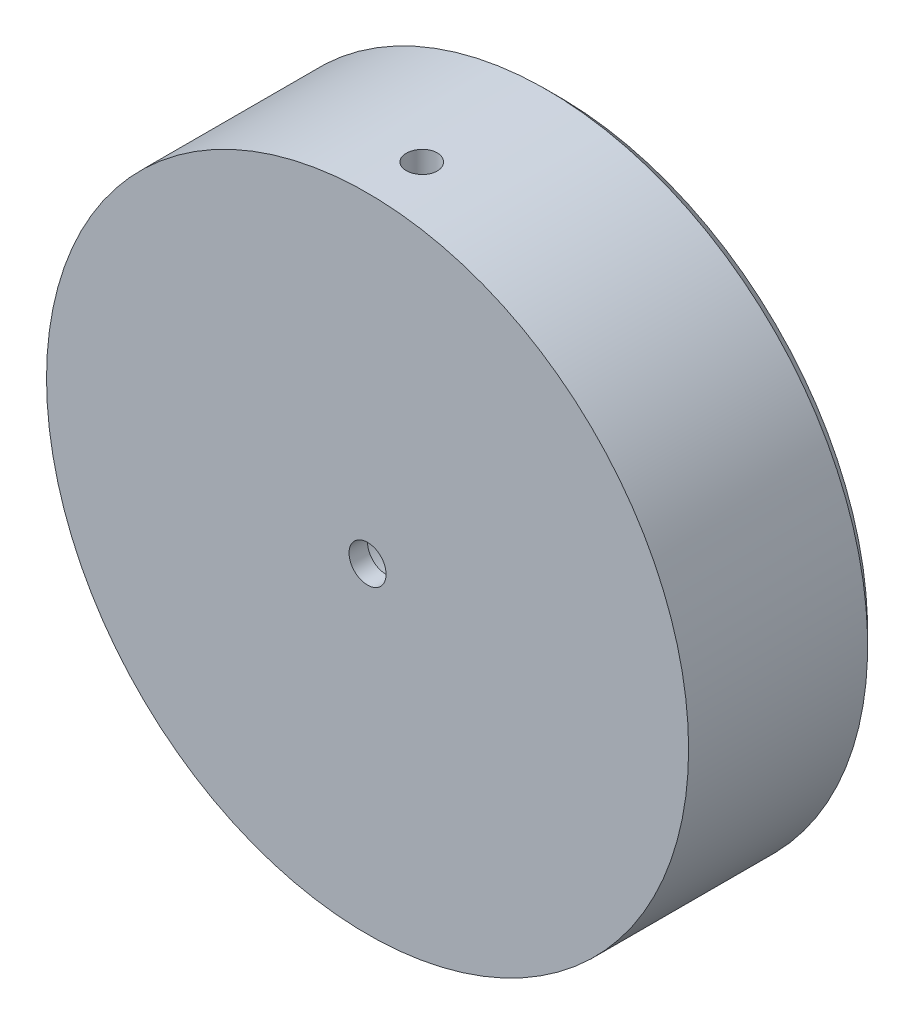
ISO-10303-21;
HEADER;
FILE_DESCRIPTION(('STEP AP214'),'2;1');
FILE_NAME('part.step','',(''),(''),'','','');
FILE_SCHEMA(('AUTOMOTIVE_DESIGN { 1 0 10303 214 1 1 1 1 }'));
ENDSEC;
DATA;
#1=APPLICATION_CONTEXT('core data for automotive mechanical design processes');
#2=APPLICATION_PROTOCOL_DEFINITION('international standard','automotive_design',2000,#1);
#3=PRODUCT_CONTEXT('',#1,'mechanical');
#4=PRODUCT('Part','Part','',(#3));
#5=PRODUCT_RELATED_PRODUCT_CATEGORY('part','',(#4));
#6=PRODUCT_DEFINITION_FORMATION('','',#4);
#7=PRODUCT_DEFINITION_CONTEXT('part definition',#1,'design');
#8=PRODUCT_DEFINITION('design','',#6,#7);
#9=PRODUCT_DEFINITION_SHAPE('','',#8);
#10=(LENGTH_UNIT() NAMED_UNIT(*) SI_UNIT(.MILLI.,.METRE.));
#11=(NAMED_UNIT(*) PLANE_ANGLE_UNIT() SI_UNIT($,.RADIAN.));
#12=(NAMED_UNIT(*) SI_UNIT($,.STERADIAN.) SOLID_ANGLE_UNIT());
#13=UNCERTAINTY_MEASURE_WITH_UNIT(LENGTH_MEASURE(1.E-05),#10,'distance_accuracy_value','');
#14=(GEOMETRIC_REPRESENTATION_CONTEXT(3) GLOBAL_UNCERTAINTY_ASSIGNED_CONTEXT((#13)) GLOBAL_UNIT_ASSIGNED_CONTEXT((#10,
#11,#12)) REPRESENTATION_CONTEXT('',''));
#15=CARTESIAN_POINT('',(0.,0.,0.));
#16=DIRECTION('',(0.,0.,1.));
#17=DIRECTION('',(1.,0.,0.));
#18=AXIS2_PLACEMENT_3D('',#15,#16,#17);
#19=CARTESIAN_POINT('',(0.,0.,11.));
#20=DIRECTION('',(0.,0.,-1.));
#21=DIRECTION('',(-1.,0.,0.));
#22=AXIS2_PLACEMENT_3D('',#19,#20,#21);
#23=CYLINDRICAL_SURFACE('',#22,26.);
#24=CARTESIAN_POINT('',(0.,0.,2.99999999999998));
#25=DIRECTION('',(0.,0.,-1.));
#26=DIRECTION('',(-1.,0.,0.));
#27=AXIS2_PLACEMENT_3D('',#24,#25,#26);
#28=CIRCLE('',#27,26.);
#29=CARTESIAN_POINT('',(-26.,0.,2.99999999999998));
#30=VERTEX_POINT('',#29);
#31=EDGE_CURVE('E12',#30,#30,#28,.F.);
#32=ORIENTED_EDGE('',*,*,#31,.T.);
#33=EDGE_LOOP('',(#32));
#34=FACE_BOUND('',#33,.T.);
#35=CARTESIAN_POINT('',(0.,0.,17.5));
#36=DIRECTION('',(0.,0.,1.));
#37=DIRECTION('',(1.,0.,0.));
#38=AXIS2_PLACEMENT_3D('',#35,#36,#37);
#39=CIRCLE('',#38,26.);
#40=CARTESIAN_POINT('',(26.,0.,17.5));
#41=VERTEX_POINT('',#40);
#42=EDGE_CURVE('E141',#41,#41,#39,.T.);
#43=ORIENTED_EDGE('',*,*,#42,.F.);
#44=EDGE_LOOP('',(#43));
#45=FACE_BOUND('',#44,.T.);
#46=CARTESIAN_POINT('',(0.,-26.,11.8645712177792));
#47=CARTESIAN_POINT('',(0.0701695561151652,-25.9999995976547,11.8645743157667));
#48=CARTESIAN_POINT('',(0.140388958718594,-25.9997128936258,11.8704995807191));
#49=CARTESIAN_POINT('',(0.27889090278876,-25.9985967368913,11.8940527434735));
#50=CARTESIAN_POINT('',(0.347171059186724,-25.9977666436775,11.9116944521335));
#51=CARTESIAN_POINT('',(0.479768117073597,-25.9956576674722,11.9581744506978));
#52=CARTESIAN_POINT('',(0.544087009687894,-25.9943790121503,11.9870070613979));
#53=CARTESIAN_POINT('',(0.666954480148832,-25.9915169453824,12.0550417525321));
#54=CARTESIAN_POINT('',(0.725504421104487,-25.9899336061905,12.0942413753071));
#55=CARTESIAN_POINT('',(0.835244792595786,-25.9866386346083,12.1819387219476));
#56=CARTESIAN_POINT('',(0.886429111167759,-25.9849268974451,12.2304440907066));
#57=CARTESIAN_POINT('',(0.979933258922688,-25.9815689581539,12.3353608855472));
#58=CARTESIAN_POINT('',(1.02225272708221,-25.9799227586972,12.3917726334623));
#59=CARTESIAN_POINT('',(1.09684231530584,-25.9768808016322,12.5109323922144));
#60=CARTESIAN_POINT('',(1.12910772587333,-25.9754851615196,12.5736833542812));
#61=CARTESIAN_POINT('',(1.18264306894247,-25.9731029643225,12.7037194831363));
#62=CARTESIAN_POINT('',(1.20391308023333,-25.9721164043067,12.7710046174304));
#63=CARTESIAN_POINT('',(1.2348378712367,-25.9706645550608,12.9081434547726));
#64=CARTESIAN_POINT('',(1.24450170422026,-25.9701988595557,12.9779951119394));
#65=CARTESIAN_POINT('',(1.25196774759407,-25.9698400341948,13.1183306222645));
#66=CARTESIAN_POINT('',(1.24977004613307,-25.9699469000839,13.1888144707208));
#67=CARTESIAN_POINT('',(1.23358295325855,-25.9707207687367,13.3283520675029));
#68=CARTESIAN_POINT('',(1.21960334242497,-25.9713873068948,13.3974069533607));
#69=CARTESIAN_POINT('',(1.18026441506609,-25.9732046614086,13.5321887258588));
#70=CARTESIAN_POINT('',(1.15490505316052,-25.9743554796955,13.5979155992263));
#71=CARTESIAN_POINT('',(1.09351530520789,-25.9770122201859,13.7242071165568));
#72=CARTESIAN_POINT('',(1.05748045716981,-25.9785182908191,13.7847695883168));
#73=CARTESIAN_POINT('',(0.975765888908268,-25.9817156318731,13.8989893933324));
#74=CARTESIAN_POINT('',(0.930086106038823,-25.9834069034968,13.9526466817336));
#75=CARTESIAN_POINT('',(0.830323141173972,-25.9867860851073,14.0515899167652));
#76=CARTESIAN_POINT('',(0.776231488588205,-25.9884739899492,14.0968673232447));
#77=CARTESIAN_POINT('',(0.66121002860167,-25.9916545390095,14.1776997344055));
#78=CARTESIAN_POINT('',(0.600280219599253,-25.9931471831821,14.2132547368097));
#79=CARTESIAN_POINT('',(0.473307051874366,-25.995769042974,14.2736322304731));
#80=CARTESIAN_POINT('',(0.407263552861189,-25.9968982486182,14.2984544271618));
#81=CARTESIAN_POINT('',(0.271939943082523,-25.9986658180569,14.3366561318553));
#82=CARTESIAN_POINT('',(0.202659854731745,-25.9993041852501,14.3500357190925));
#83=CARTESIAN_POINT('',(0.062903821132136,-26.0000176943794,14.3649618890278));
#84=CARTESIAN_POINT('',(-0.00757085970868685,-26.0000933985952,14.3665202849011));
#85=CARTESIAN_POINT('',(-0.147780736000379,-25.9996745420575,14.3577906583359));
#86=CARTESIAN_POINT('',(-0.217515933708619,-25.9991799830452,14.3475026720707));
#87=CARTESIAN_POINT('',(-0.354234236143891,-25.9976766694653,14.3153820966644));
#88=CARTESIAN_POINT('',(-0.421218610143831,-25.9966681549919,14.2935548978886));
#89=CARTESIAN_POINT('',(-0.550572910728279,-25.9942504870279,14.2389809560771));
#90=CARTESIAN_POINT('',(-0.612942812770936,-25.9928413314067,14.2062341549711));
#91=CARTESIAN_POINT('',(-0.73135197588907,-25.9897795291454,14.1307203035818));
#92=CARTESIAN_POINT('',(-0.787386179380731,-25.9881266903718,14.0879453306799));
#93=CARTESIAN_POINT('',(-0.891482494695716,-25.9847643200244,13.9936009418443));
#94=CARTESIAN_POINT('',(-0.939544559017697,-25.9830547881128,13.9420314735132));
#95=CARTESIAN_POINT('',(-1.02637202583794,-25.9797701157755,13.831511164261));
#96=CARTESIAN_POINT('',(-1.06512978778986,-25.9781950864805,13.7725543169901));
#97=CARTESIAN_POINT('',(-1.13219624153139,-25.9753587700805,13.6489631941497));
#98=CARTESIAN_POINT('',(-1.16050497622999,-25.9740974816872,13.5843289418958));
#99=CARTESIAN_POINT('',(-1.2058564616082,-25.9720316670993,13.451246098698));
#100=CARTESIAN_POINT('',(-1.22290409155323,-25.9712269431036,13.382799173685));
#101=CARTESIAN_POINT('',(-1.24526540964632,-25.9701644448953,13.2440106019318));
#102=CARTESIAN_POINT('',(-1.25057915775418,-25.969906667888,13.1736689648753));
#103=CARTESIAN_POINT('',(-1.24932129687196,-25.969967202938,13.0331637883703));
#104=CARTESIAN_POINT('',(-1.24276170948845,-25.9702849323025,12.9630001407296));
#105=CARTESIAN_POINT('',(-1.21796821893264,-25.9714594379631,12.8247714537295));
#106=CARTESIAN_POINT('',(-1.19973429338584,-25.9723162152923,12.7567064183924));
#107=CARTESIAN_POINT('',(-1.15211212905805,-25.9744721205151,12.624604427026));
#108=CARTESIAN_POINT('',(-1.12272379169086,-25.9757712523183,12.5605675066043));
#109=CARTESIAN_POINT('',(-1.05362920251174,-25.978665398012,12.4383360722146));
#110=CARTESIAN_POINT('',(-1.01392327392123,-25.9802604026333,12.3801413753052));
#111=CARTESIAN_POINT('',(-0.925277902502913,-25.9835683515007,12.271186495163));
#112=CARTESIAN_POINT('',(-0.876330151668588,-25.9852814009774,12.2204330748221));
#113=CARTESIAN_POINT('',(-0.770594686785615,-25.9886316571485,12.1278482344445));
#114=CARTESIAN_POINT('',(-0.713805045535864,-25.990268845067,12.0860190140453));
#115=CARTESIAN_POINT('',(-0.593955935661774,-25.9932839501657,12.0124518784978));
#116=CARTESIAN_POINT('',(-0.530890739390169,-25.9946616271134,11.9807232950794));
#117=CARTESIAN_POINT('',(-0.400369159006748,-25.9969988103492,11.9283426285481));
#118=CARTESIAN_POINT('',(-0.332918073924432,-25.9979588108669,11.9076774475848));
#119=CARTESIAN_POINT('',(-0.22087256212091,-25.9990982367549,11.8834373278577));
#120=CARTESIAN_POINT('',(-0.177004061389329,-25.9994349140644,11.8763715534932));
#121=CARTESIAN_POINT('',(-0.0887636901767567,-25.9998859228688,11.8669375203478));
#122=CARTESIAN_POINT('',(-0.0443918200909543,-26.0000002545383,11.8645692578794));
#123=CARTESIAN_POINT('',(0.,-26.,11.8645712177792));
#124=B_SPLINE_CURVE_WITH_KNOTS('',3,(#46,#47,#48,#49,#50,#51,#52,#53,#54,#55,#56,#57,#58,#59,
#60,#61,#62,#63,#64,#65,#66,#67,#68,#69,#70,#71,#72,#73,#74,#75,#76,#77,#78,#79,#80,#81,#82,#83,
#84,#85,#86,#87,#88,#89,#90,#91,#92,#93,#94,#95,#96,#97,#98,#99,#100,#101,#102,#103,#104,#105,
#106,#107,#108,#109,#110,#111,#112,#113,#114,#115,#116,#117,#118,#119,#120,#121,#122,#123),
.UNSPECIFIED.,.T.,.F.,(4,2,2,2,2,2,2,2,2,2,2,2,2,2,2,2,2,2,2,2,2,2,2,2,2,2,2,2,2,2,2,2,2,2,2,2,
2,2,4),(0.,0.210346622928276,0.420941634856017,0.631429912618444,0.84186833556789,
1.05248038480846,1.26310100961498,1.47382014501586,1.68453777045565,1.89509092096289,
2.10564250675102,2.31601947818195,2.52639728856384,2.73686315408808,2.94733038667675,
3.1580109446923,3.36869155205407,3.57937794134848,3.79006287176936,4.000537232358,
4.21101095026024,4.42138643537371,4.63176303927882,4.8423064117655,5.0528510387127,
5.26356797464963,5.47428404526638,5.6849087558234,5.89553239009184,6.10594288978745,
6.31635379274736,6.52676655542824,6.73717272725723,6.94776895372633,7.15841702815379,
7.36925915413334,7.57985111114493,7.71292416004448,7.84599710447706),.UNSPECIFIED.);
#125=CARTESIAN_POINT('',(0.,-26.,11.8645712177792));
#126=VERTEX_POINT('',#125);
#127=EDGE_CURVE('E96',#126,#126,#124,.T.);
#128=ORIENTED_EDGE('',*,*,#127,.F.);
#129=EDGE_LOOP('',(#128));
#130=FACE_BOUND('',#129,.T.);
#131=CARTESIAN_POINT('',(0.,26.,11.8645712177792));
#132=CARTESIAN_POINT('',(-0.0701695561151617,25.9999995976547,11.8645743157667));
#133=CARTESIAN_POINT('',(-0.14038895871859,25.9997128936258,11.8704995807191));
#134=CARTESIAN_POINT('',(-0.278890902788757,25.9985967368913,11.8940527434735));
#135=CARTESIAN_POINT('',(-0.347171059186721,25.9977666436775,11.9116944521335));
#136=CARTESIAN_POINT('',(-0.479768117073594,25.9956576674722,11.9581744506978));
#137=CARTESIAN_POINT('',(-0.544087009687892,25.9943790121503,11.9870070613979));
#138=CARTESIAN_POINT('',(-0.66695448014883,25.9915169453824,12.0550417525321));
#139=CARTESIAN_POINT('',(-0.725504421104484,25.9899336061905,12.0942413753071));
#140=CARTESIAN_POINT('',(-0.835244792595782,25.9866386346083,12.1819387219476));
#141=CARTESIAN_POINT('',(-0.886429111167755,25.9849268974451,12.2304440907066));
#142=CARTESIAN_POINT('',(-0.979933258922685,25.9815689581539,12.3353608855472));
#143=CARTESIAN_POINT('',(-1.0222527270822,25.9799227586972,12.3917726334623));
#144=CARTESIAN_POINT('',(-1.09684231530584,25.9768808016322,12.5109323922144));
#145=CARTESIAN_POINT('',(-1.12910772587332,25.9754851615196,12.5736833542812));
#146=CARTESIAN_POINT('',(-1.18264306894246,25.9731029643225,12.7037194831363));
#147=CARTESIAN_POINT('',(-1.20391308023333,25.9721164043067,12.7710046174304));
#148=CARTESIAN_POINT('',(-1.2348378712367,25.9706645550608,12.9081434547726));
#149=CARTESIAN_POINT('',(-1.24450170422025,25.9701988595557,12.9779951119394));
#150=CARTESIAN_POINT('',(-1.25196774759407,25.9698400341948,13.1183306222645));
#151=CARTESIAN_POINT('',(-1.24977004613306,25.9699469000839,13.1888144707208));
#152=CARTESIAN_POINT('',(-1.23358295325855,25.9707207687367,13.3283520675029));
#153=CARTESIAN_POINT('',(-1.21960334242496,25.9713873068948,13.3974069533607));
#154=CARTESIAN_POINT('',(-1.18026441506609,25.9732046614086,13.5321887258588));
#155=CARTESIAN_POINT('',(-1.15490505316051,25.9743554796955,13.5979155992263));
#156=CARTESIAN_POINT('',(-1.09351530520788,25.9770122201859,13.7242071165568));
#157=CARTESIAN_POINT('',(-1.0574804571698,25.9785182908191,13.7847695883168));
#158=CARTESIAN_POINT('',(-0.975765888908264,25.9817156318731,13.8989893933324));
#159=CARTESIAN_POINT('',(-0.930086106038819,25.9834069034968,13.9526466817336));
#160=CARTESIAN_POINT('',(-0.830323141173969,25.9867860851073,14.0515899167652));
#161=CARTESIAN_POINT('',(-0.776231488588201,25.9884739899492,14.0968673232447));
#162=CARTESIAN_POINT('',(-0.661210028601667,25.9916545390095,14.1776997344055));
#163=CARTESIAN_POINT('',(-0.60028021959925,25.9931471831821,14.2132547368097));
#164=CARTESIAN_POINT('',(-0.473307051874363,25.995769042974,14.2736322304731));
#165=CARTESIAN_POINT('',(-0.407263552861185,25.9968982486182,14.2984544271618));
#166=CARTESIAN_POINT('',(-0.27193994308252,25.9986658180569,14.3366561318553));
#167=CARTESIAN_POINT('',(-0.202659854731742,25.9993041852501,14.3500357190925));
#168=CARTESIAN_POINT('',(-0.0629038211321324,26.0000176943794,14.3649618890278));
#169=CARTESIAN_POINT('',(0.0075708597086905,26.0000933985952,14.3665202849011));
#170=CARTESIAN_POINT('',(0.147780736000382,25.9996745420575,14.3577906583359));
#171=CARTESIAN_POINT('',(0.217515933708623,25.9991799830452,14.3475026720707));
#172=CARTESIAN_POINT('',(0.354234236143894,25.9976766694653,14.3153820966644));
#173=CARTESIAN_POINT('',(0.421218610143835,25.9966681549919,14.2935548978886));
#174=CARTESIAN_POINT('',(0.550572910728283,25.9942504870279,14.2389809560771));
#175=CARTESIAN_POINT('',(0.612942812770939,25.9928413314067,14.2062341549711));
#176=CARTESIAN_POINT('',(0.731351975889073,25.9897795291454,14.1307203035818));
#177=CARTESIAN_POINT('',(0.787386179380734,25.9881266903718,14.0879453306799));
#178=CARTESIAN_POINT('',(0.891482494695719,25.9847643200244,13.9936009418443));
#179=CARTESIAN_POINT('',(0.9395445590177,25.9830547881128,13.9420314735132));
#180=CARTESIAN_POINT('',(1.02637202583794,25.9797701157755,13.831511164261));
#181=CARTESIAN_POINT('',(1.06512978778987,25.9781950864805,13.7725543169901));
#182=CARTESIAN_POINT('',(1.13219624153139,25.9753587700805,13.6489631941497));
#183=CARTESIAN_POINT('',(1.16050497623,25.9740974816872,13.5843289418958));
#184=CARTESIAN_POINT('',(1.20585646160821,25.9720316670993,13.451246098698));
#185=CARTESIAN_POINT('',(1.22290409155323,25.9712269431036,13.382799173685));
#186=CARTESIAN_POINT('',(1.24526540964633,25.9701644448953,13.2440106019318));
#187=CARTESIAN_POINT('',(1.25057915775418,25.969906667888,13.1736689648753));
#188=CARTESIAN_POINT('',(1.24932129687197,25.969967202938,13.0331637883703));
#189=CARTESIAN_POINT('',(1.24276170948845,25.9702849323025,12.9630001407296));
#190=CARTESIAN_POINT('',(1.21796821893264,25.9714594379631,12.8247714537295));
#191=CARTESIAN_POINT('',(1.19973429338584,25.9723162152923,12.7567064183924));
#192=CARTESIAN_POINT('',(1.15211212905805,25.9744721205151,12.624604427026));
#193=CARTESIAN_POINT('',(1.12272379169086,25.9757712523183,12.5605675066043));
#194=CARTESIAN_POINT('',(1.05362920251174,25.978665398012,12.4383360722146));
#195=CARTESIAN_POINT('',(1.01392327392124,25.9802604026333,12.3801413753052));
#196=CARTESIAN_POINT('',(0.925277902502916,25.9835683515007,12.271186495163));
#197=CARTESIAN_POINT('',(0.876330151668592,25.9852814009774,12.2204330748221));
#198=CARTESIAN_POINT('',(0.770594686785619,25.9886316571485,12.1278482344445));
#199=CARTESIAN_POINT('',(0.713805045535868,25.990268845067,12.0860190140453));
#200=CARTESIAN_POINT('',(0.593955935661777,25.9932839501657,12.0124518784978));
#201=CARTESIAN_POINT('',(0.530890739390171,25.9946616271134,11.9807232950794));
#202=CARTESIAN_POINT('',(0.400369159006751,25.9969988103492,11.9283426285481));
#203=CARTESIAN_POINT('',(0.332918073924436,25.9979588108669,11.9076774475848));
#204=CARTESIAN_POINT('',(0.220872562120913,25.9990982367549,11.8834373278577));
#205=CARTESIAN_POINT('',(0.177004061389333,25.9994349140644,11.8763715534932));
#206=CARTESIAN_POINT('',(0.08876369017676,25.9998859228688,11.8669375203478));
#207=CARTESIAN_POINT('',(0.0443918200909577,26.0000002545383,11.8645692578794));
#208=CARTESIAN_POINT('',(0.,26.,11.8645712177792));
#209=B_SPLINE_CURVE_WITH_KNOTS('',3,(#131,#132,#133,#134,#135,#136,#137,#138,#139,#140,#141,
#142,#143,#144,#145,#146,#147,#148,#149,#150,#151,#152,#153,#154,#155,#156,#157,#158,#159,#160,
#161,#162,#163,#164,#165,#166,#167,#168,#169,#170,#171,#172,#173,#174,#175,#176,#177,#178,#179,
#180,#181,#182,#183,#184,#185,#186,#187,#188,#189,#190,#191,#192,#193,#194,#195,#196,#197,#198,
#199,#200,#201,#202,#203,#204,#205,#206,#207,#208),.UNSPECIFIED.,.T.,.F.,(4,2,2,2,2,2,2,2,2,2,2,
2,2,2,2,2,2,2,2,2,2,2,2,2,2,2,2,2,2,2,2,2,2,2,2,2,2,2,4),(0.,0.210346622928276,
0.420941634856017,0.631429912618445,0.84186833556789,1.05248038480846,1.26310100961498,
1.47382014501586,1.68453777045565,1.89509092096289,2.10564250675102,2.31601947818195,
2.52639728856384,2.73686315408808,2.94733038667675,3.1580109446923,3.36869155205407,
3.57937794134848,3.79006287176936,4.000537232358,4.21101095026024,4.42138643537371,
4.63176303927882,4.8423064117655,5.0528510387127,5.26356797464962,5.47428404526638,
5.6849087558234,5.89553239009184,6.10594288978745,6.31635379274736,6.52676655542824,
6.73717272725723,6.94776895372633,7.15841702815379,7.36925915413334,7.57985111114493,
7.71292416004448,7.84599710447707),.UNSPECIFIED.);
#210=CARTESIAN_POINT('',(0.,26.,11.8645712177792));
#211=VERTEX_POINT('',#210);
#212=EDGE_CURVE('E102',#211,#211,#209,.T.);
#213=ORIENTED_EDGE('',*,*,#212,.F.);
#214=EDGE_LOOP('',(#213));
#215=FACE_BOUND('',#214,.T.);
#216=ADVANCED_FACE('F51',(#34,#45,#130,#215),#23,.T.);
#217=CARTESIAN_POINT('',(0.,0.,16.));
#218=DIRECTION('',(0.,0.,-1.));
#219=DIRECTION('',(-1.,0.,0.));
#220=AXIS2_PLACEMENT_3D('',#217,#218,#219);
#221=CYLINDRICAL_SURFACE('',#220,4.5);
#222=CARTESIAN_POINT('',(0.,0.,16.));
#223=DIRECTION('',(0.,0.,-1.));
#224=DIRECTION('',(-1.,0.,0.));
#225=AXIS2_PLACEMENT_3D('',#222,#223,#224);
#226=CIRCLE('',#225,4.5);
#227=CARTESIAN_POINT('',(-4.5,0.,16.));
#228=VERTEX_POINT('',#227);
#229=EDGE_CURVE('E137',#228,#228,#226,.T.);
#230=ORIENTED_EDGE('',*,*,#229,.F.);
#231=EDGE_LOOP('',(#230));
#232=FACE_BOUND('',#231,.T.);
#233=CARTESIAN_POINT('',(0.,0.,11.));
#234=DIRECTION('',(0.,0.,-1.));
#235=DIRECTION('',(-1.,0.,0.));
#236=AXIS2_PLACEMENT_3D('',#233,#234,#235);
#237=CIRCLE('',#236,4.5);
#238=CARTESIAN_POINT('',(-4.5,0.,11.));
#239=VERTEX_POINT('',#238);
#240=EDGE_CURVE('E144',#239,#239,#237,.T.);
#241=ORIENTED_EDGE('',*,*,#240,.T.);
#242=EDGE_LOOP('',(#241));
#243=FACE_BOUND('',#242,.T.);
#244=CARTESIAN_POINT('',(0.,-4.5,11.8645712177792));
#245=CARTESIAN_POINT('',(-0.0688012508831775,-4.49999908016929,11.8645726173645));
#246=CARTESIAN_POINT('',(-0.137617123752665,-4.49840674086833,11.8702705375845));
#247=CARTESIAN_POINT('',(-0.273259475994237,-4.49220950198236,11.8928669460445));
#248=CARTESIAN_POINT('',(-0.340085103663437,-4.48760333149253,11.9097701594929));
#249=CARTESIAN_POINT('',(-0.469769949680299,-4.47588565394594,11.9541799371931));
#250=CARTESIAN_POINT('',(-0.532634390095667,-4.46877753030964,11.9816721864776));
#251=CARTESIAN_POINT('',(-0.65286069524177,-4.45280312581996,12.0464247241061));
#252=CARTESIAN_POINT('',(-0.710222070812295,-4.44393668888688,12.0836858796985));
#253=CARTESIAN_POINT('',(-0.819246784715922,-4.4251515781749,12.1679006516221));
#254=CARTESIAN_POINT('',(-0.870753112808471,-4.41521373623696,12.2150532574668));
#255=CARTESIAN_POINT('',(-0.965238185696335,-4.39552607117256,12.3172874949008));
#256=CARTESIAN_POINT('',(-1.00821573084554,-4.38577627467018,12.3723702400545));
#257=CARTESIAN_POINT('',(-1.08520808580323,-4.36737044294547,12.4901784779085));
#258=CARTESIAN_POINT('',(-1.11903874947837,-4.35873847945984,12.5530284262229));
#259=CARTESIAN_POINT('',(-1.1755895713114,-4.34382900808304,12.6838031354193));
#260=CARTESIAN_POINT('',(-1.19831197336242,-4.33755102474248,12.7517268681874));
#261=CARTESIAN_POINT('',(-1.23144924367956,-4.32825883142877,12.8889740066334));
#262=CARTESIAN_POINT('',(-1.24215036904296,-4.32516886003198,12.9582230394191));
#263=CARTESIAN_POINT('',(-1.25183427077972,-4.32237649384804,13.0975971033421));
#264=CARTESIAN_POINT('',(-1.25081944027303,-4.3226734072502,13.1677219526604));
#265=CARTESIAN_POINT('',(-1.23732671337619,-4.32655366801453,13.3045934965019));
#266=CARTESIAN_POINT('',(-1.22519902270671,-4.33003660668585,13.3713780192754));
#267=CARTESIAN_POINT('',(-1.19038731201905,-4.33973517053476,13.5019248463708));
#268=CARTESIAN_POINT('',(-1.16770238457157,-4.3459510306134,13.5656868903815));
#269=CARTESIAN_POINT('',(-1.11214373134465,-4.36050069775752,13.6892734492345));
#270=CARTESIAN_POINT('',(-1.07915021836991,-4.36885918600197,13.7490410845893));
#271=CARTESIAN_POINT('',(-1.00399440679635,-4.386739506843,13.8623127933705));
#272=CARTESIAN_POINT('',(-0.961830166290601,-4.39626158564316,13.9158155365054));
#273=CARTESIAN_POINT('',(-0.867755610284439,-4.41581072126827,14.0170350982156));
#274=CARTESIAN_POINT('',(-0.815552279702354,-4.42584370037791,14.0644788526591));
#275=CARTESIAN_POINT('',(-0.703806607201033,-4.44498199810829,14.149996948557));
#276=CARTESIAN_POINT('',(-0.644263925421963,-4.45408727373461,14.1880708558817));
#277=CARTESIAN_POINT('',(-0.519083429338112,-4.47040839712755,14.2539030334093));
#278=CARTESIAN_POINT('',(-0.453416395747745,-4.47761448645532,14.2816083217181));
#279=CARTESIAN_POINT('',(-0.318109988769713,-4.48925492501446,14.3255053162206));
#280=CARTESIAN_POINT('',(-0.248471564121129,-4.493689933237,14.3416997599358));
#281=CARTESIAN_POINT('',(-0.10952660771314,-4.49918736483408,14.3616783545582));
#282=CARTESIAN_POINT('',(-0.0402773058586791,-4.5003505382403,14.3658333626864));
#283=CARTESIAN_POINT('',(0.0979299306365694,-4.49946480293159,14.3626442194868));
#284=CARTESIAN_POINT('',(0.16688789728452,-4.49741625678167,14.3553013661312));
#285=CARTESIAN_POINT('',(0.301206913470862,-4.49040265059029,14.3296278836596));
#286=CARTESIAN_POINT('',(0.366611288163869,-4.4854933716758,14.3115072727217));
#287=CARTESIAN_POINT('',(0.493443118118723,-4.47331829169354,14.2650393501411));
#288=CARTESIAN_POINT('',(0.554870123972384,-4.46605222488463,14.2366908852097));
#289=CARTESIAN_POINT('',(0.673420140405418,-4.44973740284175,14.1699053397327));
#290=CARTESIAN_POINT('',(0.730427061953543,-4.44065471340565,14.1312706934566));
#291=CARTESIAN_POINT('',(0.837277670587002,-4.42175477128212,14.0452550819718));
#292=CARTESIAN_POINT('',(0.887119814631377,-4.41193736105189,13.9978722377135));
#293=CARTESIAN_POINT('',(0.979812026944954,-4.39229842684379,13.8939697739009));
#294=CARTESIAN_POINT('',(1.02239957885383,-4.3824860820796,13.8372137662217));
#295=CARTESIAN_POINT('',(1.09745581429008,-4.36429693304267,13.7171505798995));
#296=CARTESIAN_POINT('',(1.12992488482463,-4.35592007387163,13.6538436519366));
#297=CARTESIAN_POINT('',(1.18358105834153,-4.34164798956173,13.5227640478961));
#298=CARTESIAN_POINT('',(1.20483077484783,-4.3357390309604,13.4550185800246));
#299=CARTESIAN_POINT('',(1.23557652495357,-4.32707876892783,13.3167215083625));
#300=CARTESIAN_POINT('',(1.24507587906573,-4.32432657344887,13.2461707031461));
#301=CARTESIAN_POINT('',(1.25184859974322,-4.32237038329875,13.1069654382884));
#302=CARTESIAN_POINT('',(1.24954571014582,-4.32304340461176,13.0383330277673));
#303=CARTESIAN_POINT('',(1.23377143287259,-4.32757137052123,12.9024763239845));
#304=CARTESIAN_POINT('',(1.22030038049411,-4.33142621959091,12.835251988511));
#305=CARTESIAN_POINT('',(1.18282724248615,-4.34180718808003,12.7047039838612));
#306=CARTESIAN_POINT('',(1.15892214641117,-4.34830866913275,12.6413503751315));
#307=CARTESIAN_POINT('',(1.10133451670734,-4.36324916052054,12.5195037952719));
#308=CARTESIAN_POINT('',(1.06765033358688,-4.37168849767404,12.4610116462935));
#309=CARTESIAN_POINT('',(0.990206962020974,-4.38988810785379,12.3485435649541));
#310=CARTESIAN_POINT('',(0.946162084346268,-4.39968178982262,12.2947697410965));
#311=CARTESIAN_POINT('',(0.849781527450665,-4.41930831909362,12.1952388457258));
#312=CARTESIAN_POINT('',(0.797443795628193,-4.4291411755031,12.1494837648882));
#313=CARTESIAN_POINT('',(0.684460232307883,-4.44801839581548,12.0662130812011));
#314=CARTESIAN_POINT('',(0.623646258932175,-4.45703841192792,12.0289195944685));
#315=CARTESIAN_POINT('',(0.496361982692842,-4.47299974900605,11.9651430784898));
#316=CARTESIAN_POINT('',(0.429895030176726,-4.47994229035335,11.9386536991982));
#317=CARTESIAN_POINT('',(0.303145483766702,-4.4901607483195,11.9003511370445));
#318=CARTESIAN_POINT('',(0.243364402168743,-4.49382245661855,11.8869664301864));
#319=CARTESIAN_POINT('',(0.122392625693411,-4.49874234976285,11.8690763719567));
#320=CARTESIAN_POINT('',(0.061202098019417,-4.50000081823467,11.8645699727793));
#321=CARTESIAN_POINT('',(0.,-4.5,11.8645712177792));
#322=B_SPLINE_CURVE_WITH_KNOTS('',3,(#244,#245,#246,#247,#248,#249,#250,#251,#252,#253,#254,
#255,#256,#257,#258,#259,#260,#261,#262,#263,#264,#265,#266,#267,#268,#269,#270,#271,#272,#273,
#274,#275,#276,#277,#278,#279,#280,#281,#282,#283,#284,#285,#286,#287,#288,#289,#290,#291,#292,
#293,#294,#295,#296,#297,#298,#299,#300,#301,#302,#303,#304,#305,#306,#307,#308,#309,#310,#311,
#312,#313,#314,#315,#316,#317,#318,#319,#320,#321),.UNSPECIFIED.,.T.,.F.,(4,2,2,2,2,2,2,2,2,2,2,
2,2,2,2,2,2,2,2,2,2,2,2,2,2,2,2,2,2,2,2,2,2,2,2,2,2,2,4),(0.,0.206179193099491,0.41244538614726,
0.618433707942853,0.824440322837931,1.03507624325264,1.24574177043995,1.46037690323672,
1.67496866133384,1.88433431939189,2.09365721284144,2.29660232990422,2.49956489399153,
2.70497960040655,2.91043784592675,3.12319493838162,3.33596188658146,3.5498016563595,
3.76359055350007,3.97072010588426,4.17782627748477,4.38102317477486,4.58424299163039,
4.79168948884226,4.99918059600964,5.21305991702851,5.426931056682,5.63959564853972,
5.85220013017267,6.05722599244307,6.26224569952548,6.46539893556025,6.66858645848129,
6.87821913273771,7.0879037754062,7.30258090584733,7.51713167871718,7.7005598652503,
7.88396640253934),.UNSPECIFIED.);
#323=CARTESIAN_POINT('',(0.,-4.5,11.8645712177792));
#324=VERTEX_POINT('',#323);
#325=EDGE_CURVE('E74',#324,#324,#322,.T.);
#326=ORIENTED_EDGE('',*,*,#325,.F.);
#327=EDGE_LOOP('',(#326));
#328=FACE_BOUND('',#327,.T.);
#329=CARTESIAN_POINT('',(0.,4.5,11.8645712177792));
#330=CARTESIAN_POINT('',(0.0688012508831811,4.49999908016929,11.8645726173645));
#331=CARTESIAN_POINT('',(0.137617123752669,4.49840674086833,11.8702705375845));
#332=CARTESIAN_POINT('',(0.27325947599424,4.49220950198236,11.8928669460445));
#333=CARTESIAN_POINT('',(0.340085103663441,4.48760333149253,11.9097701594929));
#334=CARTESIAN_POINT('',(0.469769949680304,4.47588565394594,11.9541799371931));
#335=CARTESIAN_POINT('',(0.532634390095672,4.46877753030964,11.9816721864776));
#336=CARTESIAN_POINT('',(0.652860695241774,4.45280312581996,12.0464247241061));
#337=CARTESIAN_POINT('',(0.710222070812299,4.44393668888688,12.0836858796985));
#338=CARTESIAN_POINT('',(0.819246784715926,4.4251515781749,12.1679006516221));
#339=CARTESIAN_POINT('',(0.870753112808476,4.41521373623696,12.2150532574668));
#340=CARTESIAN_POINT('',(0.965238185696341,4.39552607117256,12.3172874949008));
#341=CARTESIAN_POINT('',(1.00821573084554,4.38577627467018,12.3723702400545));
#342=CARTESIAN_POINT('',(1.08520808580324,4.36737044294547,12.4901784779085));
#343=CARTESIAN_POINT('',(1.11903874947837,4.35873847945984,12.5530284262229));
#344=CARTESIAN_POINT('',(1.1755895713114,4.34382900808304,12.6838031354193));
#345=CARTESIAN_POINT('',(1.19831197336242,4.33755102474248,12.7517268681874));
#346=CARTESIAN_POINT('',(1.23144924367956,4.32825883142877,12.8889740066334));
#347=CARTESIAN_POINT('',(1.24215036904297,4.32516886003198,12.9582230394191));
#348=CARTESIAN_POINT('',(1.25183427077973,4.32237649384803,13.0975971033421));
#349=CARTESIAN_POINT('',(1.25081944027303,4.3226734072502,13.1677219526604));
#350=CARTESIAN_POINT('',(1.2373267133762,4.32655366801453,13.3045934965019));
#351=CARTESIAN_POINT('',(1.22519902270671,4.33003660668585,13.3713780192754));
#352=CARTESIAN_POINT('',(1.19038731201905,4.33973517053475,13.5019248463708));
#353=CARTESIAN_POINT('',(1.16770238457158,4.3459510306134,13.5656868903815));
#354=CARTESIAN_POINT('',(1.11214373134465,4.36050069775752,13.6892734492345));
#355=CARTESIAN_POINT('',(1.07915021836991,4.36885918600197,13.7490410845893));
#356=CARTESIAN_POINT('',(1.00399440679636,4.386739506843,13.8623127933705));
#357=CARTESIAN_POINT('',(0.961830166290602,4.39626158564316,13.9158155365054));
#358=CARTESIAN_POINT('',(0.867755610284441,4.41581072126827,14.0170350982156));
#359=CARTESIAN_POINT('',(0.815552279702357,4.42584370037791,14.0644788526591));
#360=CARTESIAN_POINT('',(0.703806607201037,4.44498199810828,14.149996948557));
#361=CARTESIAN_POINT('',(0.644263925421967,4.45408727373461,14.1880708558817));
#362=CARTESIAN_POINT('',(0.519083429338117,4.47040839712755,14.2539030334093));
#363=CARTESIAN_POINT('',(0.45341639574775,4.47761448645532,14.2816083217181));
#364=CARTESIAN_POINT('',(0.318109988769717,4.48925492501446,14.3255053162206));
#365=CARTESIAN_POINT('',(0.248471564121132,4.493689933237,14.3416997599358));
#366=CARTESIAN_POINT('',(0.109526607713143,4.49918736483408,14.3616783545582));
#367=CARTESIAN_POINT('',(0.0402773058586825,4.5003505382403,14.3658333626864));
#368=CARTESIAN_POINT('',(-0.0979299306365659,4.49946480293159,14.3626442194868));
#369=CARTESIAN_POINT('',(-0.166887897284517,4.49741625678167,14.3553013661312));
#370=CARTESIAN_POINT('',(-0.301206913470859,4.49040265059029,14.3296278836596));
#371=CARTESIAN_POINT('',(-0.366611288163866,4.4854933716758,14.3115072727217));
#372=CARTESIAN_POINT('',(-0.49344311811872,4.47331829169354,14.2650393501411));
#373=CARTESIAN_POINT('',(-0.554870123972381,4.46605222488463,14.2366908852097));
#374=CARTESIAN_POINT('',(-0.673420140405414,4.44973740284175,14.1699053397327));
#375=CARTESIAN_POINT('',(-0.730427061953539,4.44065471340565,14.1312706934566));
#376=CARTESIAN_POINT('',(-0.837277670586997,4.42175477128212,14.0452550819718));
#377=CARTESIAN_POINT('',(-0.887119814631373,4.41193736105189,13.9978722377135));
#378=CARTESIAN_POINT('',(-0.97981202694495,4.39229842684379,13.8939697739009));
#379=CARTESIAN_POINT('',(-1.02239957885383,4.3824860820796,13.8372137662217));
#380=CARTESIAN_POINT('',(-1.09745581429008,4.36429693304267,13.7171505798995));
#381=CARTESIAN_POINT('',(-1.12992488482463,4.35592007387163,13.6538436519366));
#382=CARTESIAN_POINT('',(-1.18358105834153,4.34164798956173,13.5227640478961));
#383=CARTESIAN_POINT('',(-1.20483077484783,4.3357390309604,13.4550185800246));
#384=CARTESIAN_POINT('',(-1.23557652495356,4.32707876892784,13.3167215083625));
#385=CARTESIAN_POINT('',(-1.24507587906573,4.32432657344887,13.2461707031461));
#386=CARTESIAN_POINT('',(-1.25184859974321,4.32237038329875,13.1069654382884));
#387=CARTESIAN_POINT('',(-1.24954571014582,4.32304340461176,13.0383330277673));
#388=CARTESIAN_POINT('',(-1.23377143287258,4.32757137052124,12.9024763239845));
#389=CARTESIAN_POINT('',(-1.2203003804941,4.33142621959091,12.835251988511));
#390=CARTESIAN_POINT('',(-1.18282724248614,4.34180718808003,12.7047039838612));
#391=CARTESIAN_POINT('',(-1.15892214641117,4.34830866913275,12.6413503751315));
#392=CARTESIAN_POINT('',(-1.10133451670734,4.36324916052054,12.5195037952719));
#393=CARTESIAN_POINT('',(-1.06765033358688,4.37168849767404,12.4610116462935));
#394=CARTESIAN_POINT('',(-0.990206962020971,4.38988810785379,12.3485435649541));
#395=CARTESIAN_POINT('',(-0.946162084346265,4.39968178982262,12.2947697410965));
#396=CARTESIAN_POINT('',(-0.849781527450662,4.41930831909363,12.1952388457258));
#397=CARTESIAN_POINT('',(-0.79744379562819,4.4291411755031,12.1494837648882));
#398=CARTESIAN_POINT('',(-0.684460232307879,4.44801839581548,12.0662130812011));
#399=CARTESIAN_POINT('',(-0.623646258932172,4.45703841192792,12.0289195944685));
#400=CARTESIAN_POINT('',(-0.496361982692839,4.47299974900605,11.9651430784898));
#401=CARTESIAN_POINT('',(-0.429895030176723,4.47994229035336,11.9386536991982));
#402=CARTESIAN_POINT('',(-0.303145483766698,4.4901607483195,11.9003511370445));
#403=CARTESIAN_POINT('',(-0.243364402168739,4.49382245661855,11.8869664301864));
#404=CARTESIAN_POINT('',(-0.122392625693407,4.49874234976285,11.8690763719567));
#405=CARTESIAN_POINT('',(-0.0612020980194134,4.50000081823467,11.8645699727793));
#406=CARTESIAN_POINT('',(0.,4.5,11.8645712177792));
#407=B_SPLINE_CURVE_WITH_KNOTS('',3,(#329,#330,#331,#332,#333,#334,#335,#336,#337,#338,#339,
#340,#341,#342,#343,#344,#345,#346,#347,#348,#349,#350,#351,#352,#353,#354,#355,#356,#357,#358,
#359,#360,#361,#362,#363,#364,#365,#366,#367,#368,#369,#370,#371,#372,#373,#374,#375,#376,#377,
#378,#379,#380,#381,#382,#383,#384,#385,#386,#387,#388,#389,#390,#391,#392,#393,#394,#395,#396,
#397,#398,#399,#400,#401,#402,#403,#404,#405,#406),.UNSPECIFIED.,.T.,.F.,(4,2,2,2,2,2,2,2,2,2,2,
2,2,2,2,2,2,2,2,2,2,2,2,2,2,2,2,2,2,2,2,2,2,2,2,2,2,2,4),(0.,0.206179193099491,
0.412445386147261,0.618433707942855,0.824440322837932,1.03507624325264,1.24574177043995,
1.46037690323672,1.67496866133384,1.88433431939189,2.09365721284144,2.29660232990422,
2.49956489399153,2.70497960040656,2.91043784592675,3.12319493838162,3.33596188658146,
3.5498016563595,3.76359055350007,3.97072010588426,4.17782627748477,4.38102317477486,
4.58424299163039,4.79168948884226,4.99918059600964,5.21305991702851,5.426931056682,
5.63959564853972,5.85220013017267,6.05722599244308,6.26224569952548,6.46539893556025,
6.66858645848129,6.87821913273771,7.0879037754062,7.30258090584733,7.51713167871719,
7.7005598652503,7.88396640253934),.UNSPECIFIED.);
#408=CARTESIAN_POINT('',(0.,4.5,11.8645712177792));
#409=VERTEX_POINT('',#408);
#410=EDGE_CURVE('E55',#409,#409,#407,.T.);
#411=ORIENTED_EDGE('',*,*,#410,.F.);
#412=EDGE_LOOP('',(#411));
#413=FACE_BOUND('',#412,.T.);
#414=ADVANCED_FACE('F80',(#232,#243,#328,#413),#221,.F.);
#415=CARTESIAN_POINT('',(0.,0.,11.));
#416=DIRECTION('',(0.,0.,-1.));
#417=DIRECTION('',(-1.,0.,0.));
#418=AXIS2_PLACEMENT_3D('',#415,#416,#417);
#419=CYLINDRICAL_SURFACE('',#418,13.905);
#420=CARTESIAN_POINT('',(0.,0.,11.));
#421=DIRECTION('',(0.,0.,1.));
#422=DIRECTION('',(1.,0.,0.));
#423=AXIS2_PLACEMENT_3D('',#420,#421,#422);
#424=CIRCLE('',#423,13.905);
#425=CARTESIAN_POINT('',(13.905,0.,11.));
#426=VERTEX_POINT('',#425);
#427=EDGE_CURVE('E71',#426,#426,#424,.T.);
#428=ORIENTED_EDGE('',*,*,#427,.T.);
#429=EDGE_LOOP('',(#428));
#430=FACE_BOUND('',#429,.T.);
#431=CARTESIAN_POINT('',(0.,0.,2.));
#432=DIRECTION('',(0.,0.,-1.));
#433=DIRECTION('',(-1.,0.,0.));
#434=AXIS2_PLACEMENT_3D('',#431,#432,#433);
#435=CIRCLE('',#434,13.905);
#436=CARTESIAN_POINT('',(-13.905,0.,2.));
#437=VERTEX_POINT('',#436);
#438=EDGE_CURVE('E147',#437,#437,#435,.T.);
#439=ORIENTED_EDGE('',*,*,#438,.T.);
#440=EDGE_LOOP('',(#439));
#441=FACE_BOUND('',#440,.T.);
#442=ADVANCED_FACE('F110',(#430,#441),#419,.F.);
#443=CARTESIAN_POINT('',(0.,0.,-22.5));
#444=DIRECTION('',(0.,0.,1.));
#445=DIRECTION('',(1.,0.,0.));
#446=AXIS2_PLACEMENT_3D('',#443,#444,#445);
#447=CYLINDRICAL_SURFACE('',#446,1.5);
#448=CARTESIAN_POINT('',(0.,0.,17.5));
#449=DIRECTION('',(0.,0.,1.));
#450=DIRECTION('',(1.,0.,0.));
#451=AXIS2_PLACEMENT_3D('',#448,#449,#450);
#452=CIRCLE('',#451,1.5);
#453=CARTESIAN_POINT('',(1.5,0.,17.5));
#454=VERTEX_POINT('',#453);
#455=EDGE_CURVE('E131',#454,#454,#452,.T.);
#456=ORIENTED_EDGE('',*,*,#455,.T.);
#457=EDGE_LOOP('',(#456));
#458=FACE_BOUND('',#457,.T.);
#459=CARTESIAN_POINT('',(0.,0.,16.));
#460=DIRECTION('',(0.,0.,-1.));
#461=DIRECTION('',(-1.,0.,0.));
#462=AXIS2_PLACEMENT_3D('',#459,#460,#461);
#463=CIRCLE('',#462,1.5);
#464=CARTESIAN_POINT('',(-1.5,0.,16.));
#465=VERTEX_POINT('',#464);
#466=EDGE_CURVE('E134',#465,#465,#463,.F.);
#467=ORIENTED_EDGE('',*,*,#466,.F.);
#468=EDGE_LOOP('',(#467));
#469=FACE_BOUND('',#468,.T.);
#470=ADVANCED_FACE('F114',(#458,#469),#447,.F.);
#471=CARTESIAN_POINT('',(0.,0.,11.));
#472=DIRECTION('',(0.,0.,1.));
#473=DIRECTION('',(1.,0.,0.));
#474=AXIS2_PLACEMENT_3D('',#471,#472,#473);
#475=PLANE('',#474);
#476=ORIENTED_EDGE('',*,*,#240,.F.);
#477=EDGE_LOOP('',(#476));
#478=FACE_BOUND('',#477,.T.);
#479=ORIENTED_EDGE('',*,*,#427,.F.);
#480=EDGE_LOOP('',(#479));
#481=FACE_BOUND('',#480,.T.);
#482=ADVANCED_FACE('F116',(#478,#481),#475,.F.);
#483=CARTESIAN_POINT('',(0.,0.,17.5));
#484=DIRECTION('',(0.,0.,1.));
#485=DIRECTION('',(1.,0.,0.));
#486=AXIS2_PLACEMENT_3D('',#483,#484,#485);
#487=PLANE('',#486);
#488=ORIENTED_EDGE('',*,*,#455,.F.);
#489=EDGE_LOOP('',(#488));
#490=FACE_BOUND('',#489,.T.);
#491=ORIENTED_EDGE('',*,*,#42,.T.);
#492=EDGE_LOOP('',(#491));
#493=FACE_BOUND('',#492,.T.);
#494=ADVANCED_FACE('F119',(#490,#493),#487,.T.);
#495=CARTESIAN_POINT('',(0.,0.,16.));
#496=DIRECTION('',(0.,0.,-1.));
#497=DIRECTION('',(-1.,0.,0.));
#498=AXIS2_PLACEMENT_3D('',#495,#496,#497);
#499=PLANE('',#498);
#500=ORIENTED_EDGE('',*,*,#229,.T.);
#501=EDGE_LOOP('',(#500));
#502=FACE_BOUND('',#501,.T.);
#503=ORIENTED_EDGE('',*,*,#466,.T.);
#504=EDGE_LOOP('',(#503));
#505=FACE_BOUND('',#504,.T.);
#506=ADVANCED_FACE('F122',(#502,#505),#499,.T.);
#507=CARTESIAN_POINT('',(0.,0.,2.));
#508=DIRECTION('',(0.,0.,-1.));
#509=DIRECTION('',(-1.,0.,0.));
#510=AXIS2_PLACEMENT_3D('',#507,#508,#509);
#511=PLANE('',#510);
#512=CARTESIAN_POINT('',(0.,0.,2.));
#513=DIRECTION('',(0.,0.,-1.));
#514=DIRECTION('',(-1.,0.,0.));
#515=AXIS2_PLACEMENT_3D('',#512,#513,#514);
#516=CIRCLE('',#515,25.);
#517=CARTESIAN_POINT('',(-25.,0.,2.));
#518=VERTEX_POINT('',#517);
#519=EDGE_CURVE('E65',#518,#518,#516,.T.);
#520=ORIENTED_EDGE('',*,*,#519,.T.);
#521=EDGE_LOOP('',(#520));
#522=FACE_BOUND('',#521,.T.);
#523=ORIENTED_EDGE('',*,*,#438,.F.);
#524=EDGE_LOOP('',(#523));
#525=FACE_BOUND('',#524,.T.);
#526=ADVANCED_FACE('F90',(#522,#525),#511,.T.);
#527=CARTESIAN_POINT('',(0.,0.,2.));
#528=DIRECTION('',(0.,0.,1.));
#529=DIRECTION('',(1.,0.,0.));
#530=AXIS2_PLACEMENT_3D('',#527,#528,#529);
#531=CONICAL_SURFACE('',#530,25.,0.785398163397448);
#532=ORIENTED_EDGE('',*,*,#31,.F.);
#533=EDGE_LOOP('',(#532));
#534=FACE_BOUND('',#533,.T.);
#535=ORIENTED_EDGE('',*,*,#519,.F.);
#536=EDGE_LOOP('',(#535));
#537=FACE_BOUND('',#536,.T.);
#538=ADVANCED_FACE('F53',(#534,#537),#531,.T.);
#539=CARTESIAN_POINT('',(0.,52.,13.1145712177792));
#540=DIRECTION('',(0.,-1.,0.));
#541=DIRECTION('',(0.,0.,-1.));
#542=AXIS2_PLACEMENT_3D('',#539,#540,#541);
#543=CYLINDRICAL_SURFACE('',#542,1.25);
#544=ORIENTED_EDGE('',*,*,#325,.T.);
#545=EDGE_LOOP('',(#544));
#546=FACE_BOUND('',#545,.T.);
#547=ORIENTED_EDGE('',*,*,#127,.T.);
#548=EDGE_LOOP('',(#547));
#549=FACE_BOUND('',#548,.T.);
#550=ADVANCED_FACE('F88',(#546,#549),#543,.F.);
#551=ORIENTED_EDGE('',*,*,#410,.T.);
#552=EDGE_LOOP('',(#551));
#553=FACE_BOUND('',#552,.T.);
#554=ORIENTED_EDGE('',*,*,#212,.T.);
#555=EDGE_LOOP('',(#554));
#556=FACE_BOUND('',#555,.T.);
#557=ADVANCED_FACE('F84',(#553,#556),#543,.F.);
#558=CLOSED_SHELL('',(#216,#414,#442,#470,#482,#494,#506,#526,#538,#550,#557));
#559=MANIFOLD_SOLID_BREP('B2',#558);
#560=ADVANCED_BREP_SHAPE_REPRESENTATION('',(#18,#559),#14);
#561=SHAPE_DEFINITION_REPRESENTATION(#9,#560);
ENDSEC;
END-ISO-10303-21;
